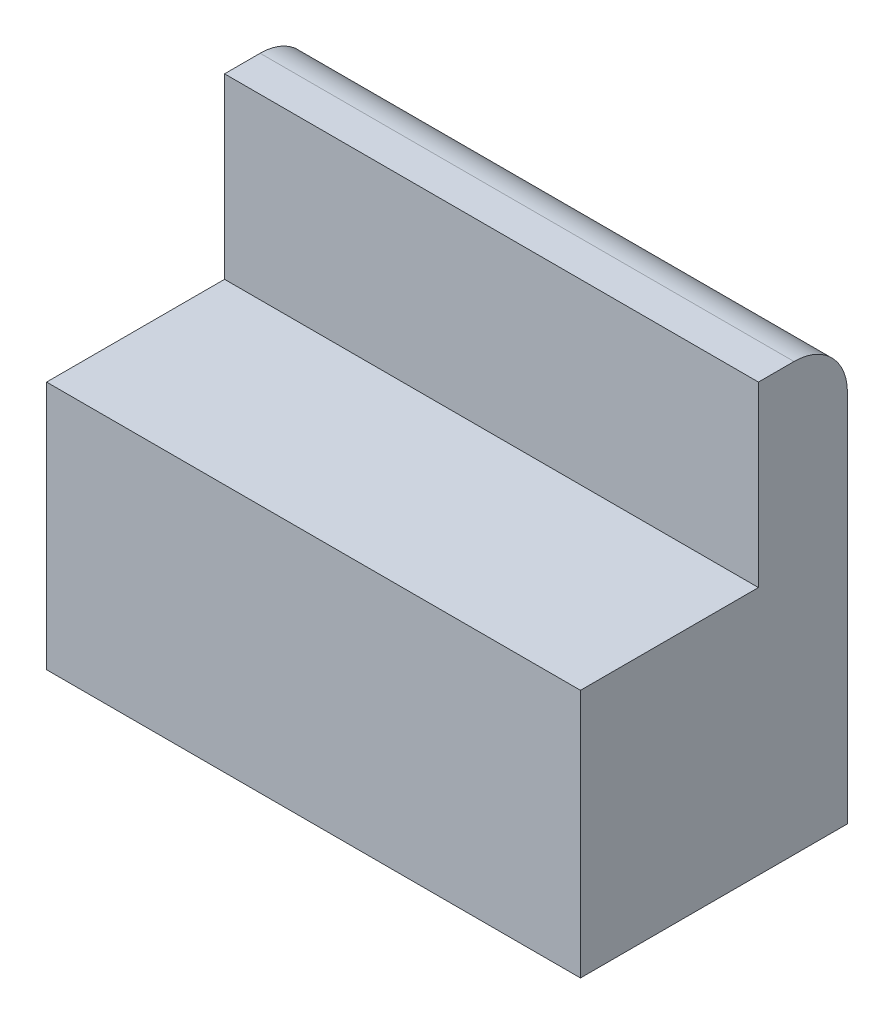
ISO-10303-21;
HEADER;
FILE_DESCRIPTION(('STEP AP214'),'2;1');
FILE_NAME('part.step','',(''),(''),'','','');
FILE_SCHEMA(('AUTOMOTIVE_DESIGN { 1 0 10303 214 1 1 1 1 }'));
ENDSEC;
DATA;
#1=APPLICATION_CONTEXT('core data for automotive mechanical design processes');
#2=APPLICATION_PROTOCOL_DEFINITION('international standard','automotive_design',2000,#1);
#3=PRODUCT_CONTEXT('',#1,'mechanical');
#4=PRODUCT('Part','Part','',(#3));
#5=PRODUCT_RELATED_PRODUCT_CATEGORY('part','',(#4));
#6=PRODUCT_DEFINITION_FORMATION('','',#4);
#7=PRODUCT_DEFINITION_CONTEXT('part definition',#1,'design');
#8=PRODUCT_DEFINITION('design','',#6,#7);
#9=PRODUCT_DEFINITION_SHAPE('','',#8);
#10=(LENGTH_UNIT() NAMED_UNIT(*) SI_UNIT(.MILLI.,.METRE.));
#11=(NAMED_UNIT(*) PLANE_ANGLE_UNIT() SI_UNIT($,.RADIAN.));
#12=(NAMED_UNIT(*) SI_UNIT($,.STERADIAN.) SOLID_ANGLE_UNIT());
#13=UNCERTAINTY_MEASURE_WITH_UNIT(LENGTH_MEASURE(1.E-05),#10,'distance_accuracy_value','');
#14=(GEOMETRIC_REPRESENTATION_CONTEXT(3) GLOBAL_UNCERTAINTY_ASSIGNED_CONTEXT((#13)) GLOBAL_UNIT_ASSIGNED_CONTEXT((#10,
#11,#12)) REPRESENTATION_CONTEXT('',''));
#15=CARTESIAN_POINT('',(0.,0.,0.));
#16=DIRECTION('',(0.,0.,1.));
#17=DIRECTION('',(1.,0.,0.));
#18=AXIS2_PLACEMENT_3D('',#15,#16,#17);
#19=CARTESIAN_POINT('',(-25.3465250965251,20.4857142857143,15.));
#20=DIRECTION('',(0.,-1.,0.));
#21=DIRECTION('',(0.,0.,-1.));
#22=AXIS2_PLACEMENT_3D('',#19,#20,#21);
#23=PLANE('',#22);
#24=DIRECTION('',(0.,0.,-1.));
#25=VECTOR('',#24,1.);
#26=CARTESIAN_POINT('',(4.65347490347492,20.4857142857143,15.));
#27=LINE('',#26,#25);
#28=CARTESIAN_POINT('',(4.65347490347492,20.4857142857143,5.));
#29=VERTEX_POINT('',#28);
#30=CARTESIAN_POINT('',(4.65347490347492,20.4857142857143,3.));
#31=VERTEX_POINT('',#30);
#32=EDGE_CURVE('E133',#29,#31,#27,.T.);
#33=ORIENTED_EDGE('',*,*,#32,.T.);
#34=DIRECTION('',(-1.,0.,0.));
#35=VECTOR('',#34,1.);
#36=CARTESIAN_POINT('',(-25.3465250965251,20.4857142857143,3.));
#37=LINE('',#36,#35);
#38=CARTESIAN_POINT('',(-25.3465250965251,20.4857142857143,3.));
#39=VERTEX_POINT('',#38);
#40=EDGE_CURVE('E142',#31,#39,#37,.T.);
#41=ORIENTED_EDGE('',*,*,#40,.T.);
#42=DIRECTION('',(0.,0.,-1.));
#43=VECTOR('',#42,1.);
#44=CARTESIAN_POINT('',(-25.3465250965251,20.4857142857143,15.));
#45=LINE('',#44,#43);
#46=CARTESIAN_POINT('',(-25.3465250965251,20.4857142857143,5.));
#47=VERTEX_POINT('',#46);
#48=EDGE_CURVE('E127',#47,#39,#45,.T.);
#49=ORIENTED_EDGE('',*,*,#48,.F.);
#50=DIRECTION('',(-1.,0.,0.));
#51=VECTOR('',#50,1.);
#52=CARTESIAN_POINT('',(-25.3465250965251,20.4857142857143,5.));
#53=LINE('',#52,#51);
#54=EDGE_CURVE('E106',#29,#47,#53,.T.);
#55=ORIENTED_EDGE('',*,*,#54,.F.);
#56=EDGE_LOOP('',(#33,#41,#49,#55));
#57=FACE_BOUND('',#56,.T.);
#58=ADVANCED_FACE('F33',(#57),#23,.F.);
#59=CARTESIAN_POINT('',(-25.3465250965251,20.4857142857143,15.));
#60=DIRECTION('',(1.,0.,0.));
#61=DIRECTION('',(0.,1.,0.));
#62=AXIS2_PLACEMENT_3D('',#59,#60,#61);
#63=PLANE('',#62);
#64=ORIENTED_EDGE('',*,*,#48,.T.);
#65=CARTESIAN_POINT('',(-25.3465250965251,17.4857142857143,3.));
#66=DIRECTION('',(1.,0.,0.));
#67=DIRECTION('',(0.,1.,0.));
#68=AXIS2_PLACEMENT_3D('',#65,#66,#67);
#69=CIRCLE('',#68,3.);
#70=CARTESIAN_POINT('',(-25.3465250965251,17.4857142857143,0.));
#71=VERTEX_POINT('',#70);
#72=EDGE_CURVE('E55',#39,#71,#69,.F.);
#73=ORIENTED_EDGE('',*,*,#72,.T.);
#74=DIRECTION('',(0.,-1.,0.));
#75=VECTOR('',#74,1.);
#76=CARTESIAN_POINT('',(-25.3465250965251,20.4857142857143,0.));
#77=LINE('',#76,#75);
#78=CARTESIAN_POINT('',(-25.3465250965251,-3.51428571428572,0.));
#79=VERTEX_POINT('',#78);
#80=EDGE_CURVE('E115',#71,#79,#77,.T.);
#81=ORIENTED_EDGE('',*,*,#80,.T.);
#82=DIRECTION('',(0.,0.,-1.));
#83=VECTOR('',#82,1.);
#84=CARTESIAN_POINT('',(-25.3465250965251,-3.51428571428572,15.));
#85=LINE('',#84,#83);
#86=CARTESIAN_POINT('',(-25.3465250965251,-3.51428571428572,15.));
#87=VERTEX_POINT('',#86);
#88=EDGE_CURVE('E139',#87,#79,#85,.T.);
#89=ORIENTED_EDGE('',*,*,#88,.F.);
#90=DIRECTION('',(0.,-1.,0.));
#91=VECTOR('',#90,1.);
#92=CARTESIAN_POINT('',(-25.3465250965251,20.4857142857143,15.));
#93=LINE('',#92,#91);
#94=CARTESIAN_POINT('',(-25.3465250965251,10.4857142857143,15.));
#95=VERTEX_POINT('',#94);
#96=EDGE_CURVE('E113',#95,#87,#93,.T.);
#97=ORIENTED_EDGE('',*,*,#96,.F.);
#98=DIRECTION('',(0.,0.,1.));
#99=VECTOR('',#98,1.);
#100=CARTESIAN_POINT('',(-25.3465250965251,10.4857142857143,5.));
#101=LINE('',#100,#99);
#102=CARTESIAN_POINT('',(-25.3465250965251,10.4857142857143,5.));
#103=VERTEX_POINT('',#102);
#104=EDGE_CURVE('E94',#103,#95,#101,.T.);
#105=ORIENTED_EDGE('',*,*,#104,.F.);
#106=DIRECTION('',(0.,-1.,0.));
#107=VECTOR('',#106,1.);
#108=CARTESIAN_POINT('',(-25.3465250965251,20.4857142857143,5.));
#109=LINE('',#108,#107);
#110=EDGE_CURVE('E101',#47,#103,#109,.T.);
#111=ORIENTED_EDGE('',*,*,#110,.F.);
#112=EDGE_LOOP('',(#64,#73,#81,#89,#97,#105,#111));
#113=FACE_BOUND('',#112,.T.);
#114=ADVANCED_FACE('F111',(#113),#63,.F.);
#115=CARTESIAN_POINT('',(-25.3465250965251,-3.51428571428572,15.));
#116=DIRECTION('',(0.,1.,0.));
#117=DIRECTION('',(0.,0.,1.));
#118=AXIS2_PLACEMENT_3D('',#115,#116,#117);
#119=PLANE('',#118);
#120=DIRECTION('',(1.,0.,0.));
#121=VECTOR('',#120,1.);
#122=CARTESIAN_POINT('',(-25.3465250965251,-3.51428571428572,0.));
#123=LINE('',#122,#121);
#124=CARTESIAN_POINT('',(4.65347490347492,-3.51428571428572,0.));
#125=VERTEX_POINT('',#124);
#126=EDGE_CURVE('E129',#79,#125,#123,.T.);
#127=ORIENTED_EDGE('',*,*,#126,.T.);
#128=DIRECTION('',(0.,0.,-1.));
#129=VECTOR('',#128,1.);
#130=CARTESIAN_POINT('',(4.65347490347492,-3.51428571428572,15.));
#131=LINE('',#130,#129);
#132=CARTESIAN_POINT('',(4.65347490347492,-3.51428571428572,15.));
#133=VERTEX_POINT('',#132);
#134=EDGE_CURVE('E136',#133,#125,#131,.T.);
#135=ORIENTED_EDGE('',*,*,#134,.F.);
#136=DIRECTION('',(1.,0.,0.));
#137=VECTOR('',#136,1.);
#138=CARTESIAN_POINT('',(-25.3465250965251,-3.51428571428572,15.));
#139=LINE('',#138,#137);
#140=EDGE_CURVE('E121',#87,#133,#139,.T.);
#141=ORIENTED_EDGE('',*,*,#140,.F.);
#142=ORIENTED_EDGE('',*,*,#88,.T.);
#143=EDGE_LOOP('',(#127,#135,#141,#142));
#144=FACE_BOUND('',#143,.T.);
#145=ADVANCED_FACE('F158',(#144),#119,.F.);
#146=CARTESIAN_POINT('',(4.65347490347492,20.4857142857143,15.));
#147=DIRECTION('',(-1.,0.,0.));
#148=DIRECTION('',(0.,-1.,0.));
#149=AXIS2_PLACEMENT_3D('',#146,#147,#148);
#150=PLANE('',#149);
#151=DIRECTION('',(0.,1.,0.));
#152=VECTOR('',#151,1.);
#153=CARTESIAN_POINT('',(4.65347490347492,20.4857142857143,0.));
#154=LINE('',#153,#152);
#155=CARTESIAN_POINT('',(4.65347490347492,17.4857142857143,0.));
#156=VERTEX_POINT('',#155);
#157=EDGE_CURVE('E122',#125,#156,#154,.T.);
#158=ORIENTED_EDGE('',*,*,#157,.T.);
#159=CARTESIAN_POINT('',(4.65347490347491,17.4857142857143,3.));
#160=DIRECTION('',(-1.,0.,0.));
#161=DIRECTION('',(0.,-1.,0.));
#162=AXIS2_PLACEMENT_3D('',#159,#160,#161);
#163=CIRCLE('',#162,3.);
#164=EDGE_CURVE('E11',#156,#31,#163,.F.);
#165=ORIENTED_EDGE('',*,*,#164,.T.);
#166=ORIENTED_EDGE('',*,*,#32,.F.);
#167=DIRECTION('',(0.,1.,0.));
#168=VECTOR('',#167,1.);
#169=CARTESIAN_POINT('',(4.65347490347492,20.4857142857143,5.));
#170=LINE('',#169,#168);
#171=CARTESIAN_POINT('',(4.65347490347492,10.4857142857143,5.));
#172=VERTEX_POINT('',#171);
#173=EDGE_CURVE('E100',#172,#29,#170,.T.);
#174=ORIENTED_EDGE('',*,*,#173,.F.);
#175=DIRECTION('',(0.,0.,1.));
#176=VECTOR('',#175,1.);
#177=CARTESIAN_POINT('',(4.65347490347492,10.4857142857143,5.));
#178=LINE('',#177,#176);
#179=CARTESIAN_POINT('',(4.65347490347492,10.4857142857143,15.));
#180=VERTEX_POINT('',#179);
#181=EDGE_CURVE('E97',#172,#180,#178,.T.);
#182=ORIENTED_EDGE('',*,*,#181,.T.);
#183=DIRECTION('',(0.,1.,0.));
#184=VECTOR('',#183,1.);
#185=CARTESIAN_POINT('',(4.65347490347492,20.4857142857143,15.));
#186=LINE('',#185,#184);
#187=EDGE_CURVE('E124',#133,#180,#186,.T.);
#188=ORIENTED_EDGE('',*,*,#187,.F.);
#189=ORIENTED_EDGE('',*,*,#134,.T.);
#190=EDGE_LOOP('',(#158,#165,#166,#174,#182,#188,#189));
#191=FACE_BOUND('',#190,.T.);
#192=ADVANCED_FACE('F151',(#191),#150,.F.);
#193=CARTESIAN_POINT('',(0.,0.,15.));
#194=DIRECTION('',(0.,0.,1.));
#195=DIRECTION('',(1.,0.,0.));
#196=AXIS2_PLACEMENT_3D('',#193,#194,#195);
#197=PLANE('',#196);
#198=DIRECTION('',(1.,0.,0.));
#199=VECTOR('',#198,1.);
#200=CARTESIAN_POINT('',(-25.3465250965251,10.4857142857143,15.));
#201=LINE('',#200,#199);
#202=EDGE_CURVE('E108',#95,#180,#201,.T.);
#203=ORIENTED_EDGE('',*,*,#202,.F.);
#204=ORIENTED_EDGE('',*,*,#96,.T.);
#205=ORIENTED_EDGE('',*,*,#140,.T.);
#206=ORIENTED_EDGE('',*,*,#187,.T.);
#207=EDGE_LOOP('',(#203,#204,#205,#206));
#208=FACE_BOUND('',#207,.T.);
#209=ADVANCED_FACE('F160',(#208),#197,.T.);
#210=CARTESIAN_POINT('',(0.,0.,0.));
#211=DIRECTION('',(0.,0.,1.));
#212=DIRECTION('',(1.,0.,0.));
#213=AXIS2_PLACEMENT_3D('',#210,#211,#212);
#214=PLANE('',#213);
#215=ORIENTED_EDGE('',*,*,#80,.F.);
#216=DIRECTION('',(-1.,0.,0.));
#217=VECTOR('',#216,1.);
#218=CARTESIAN_POINT('',(0.,17.4857142857143,0.));
#219=LINE('',#218,#217);
#220=EDGE_CURVE('E41',#71,#156,#219,.F.);
#221=ORIENTED_EDGE('',*,*,#220,.T.);
#222=ORIENTED_EDGE('',*,*,#157,.F.);
#223=ORIENTED_EDGE('',*,*,#126,.F.);
#224=EDGE_LOOP('',(#215,#221,#222,#223));
#225=FACE_BOUND('',#224,.T.);
#226=ADVANCED_FACE('F155',(#225),#214,.F.);
#227=CARTESIAN_POINT('',(-25.3465250965251,10.4857142857143,5.));
#228=DIRECTION('',(0.,-1.,0.));
#229=DIRECTION('',(0.,0.,-1.));
#230=AXIS2_PLACEMENT_3D('',#227,#228,#229);
#231=PLANE('',#230);
#232=ORIENTED_EDGE('',*,*,#202,.T.);
#233=ORIENTED_EDGE('',*,*,#181,.F.);
#234=DIRECTION('',(1.,0.,0.));
#235=VECTOR('',#234,1.);
#236=CARTESIAN_POINT('',(-25.3465250965251,10.4857142857143,5.));
#237=LINE('',#236,#235);
#238=EDGE_CURVE('E90',#103,#172,#237,.T.);
#239=ORIENTED_EDGE('',*,*,#238,.F.);
#240=ORIENTED_EDGE('',*,*,#104,.T.);
#241=EDGE_LOOP('',(#232,#233,#239,#240));
#242=FACE_BOUND('',#241,.T.);
#243=ADVANCED_FACE('F92',(#242),#231,.F.);
#244=CARTESIAN_POINT('',(0.,0.,5.));
#245=DIRECTION('',(0.,0.,1.));
#246=DIRECTION('',(1.,0.,0.));
#247=AXIS2_PLACEMENT_3D('',#244,#245,#246);
#248=PLANE('',#247);
#249=ORIENTED_EDGE('',*,*,#110,.T.);
#250=ORIENTED_EDGE('',*,*,#238,.T.);
#251=ORIENTED_EDGE('',*,*,#173,.T.);
#252=ORIENTED_EDGE('',*,*,#54,.T.);
#253=EDGE_LOOP('',(#249,#250,#251,#252));
#254=FACE_BOUND('',#253,.T.);
#255=ADVANCED_FACE('F104',(#254),#248,.T.);
#256=CARTESIAN_POINT('',(-25.3465250965251,17.4857142857143,3.));
#257=DIRECTION('',(-1.,0.,0.));
#258=DIRECTION('',(0.,0.,1.));
#259=AXIS2_PLACEMENT_3D('',#256,#257,#258);
#260=CYLINDRICAL_SURFACE('',#259,3.);
#261=ORIENTED_EDGE('',*,*,#164,.F.);
#262=ORIENTED_EDGE('',*,*,#220,.F.);
#263=ORIENTED_EDGE('',*,*,#72,.F.);
#264=ORIENTED_EDGE('',*,*,#40,.F.);
#265=EDGE_LOOP('',(#261,#262,#263,#264));
#266=FACE_BOUND('',#265,.T.);
#267=ADVANCED_FACE('F35',(#266),#260,.T.);
#268=CLOSED_SHELL('',(#58,#114,#145,#192,#209,#226,#243,#255,#267));
#269=MANIFOLD_SOLID_BREP('B2',#268);
#270=ADVANCED_BREP_SHAPE_REPRESENTATION('',(#18,#269),#14);
#271=SHAPE_DEFINITION_REPRESENTATION(#9,#270);
ENDSEC;
END-ISO-10303-21;
